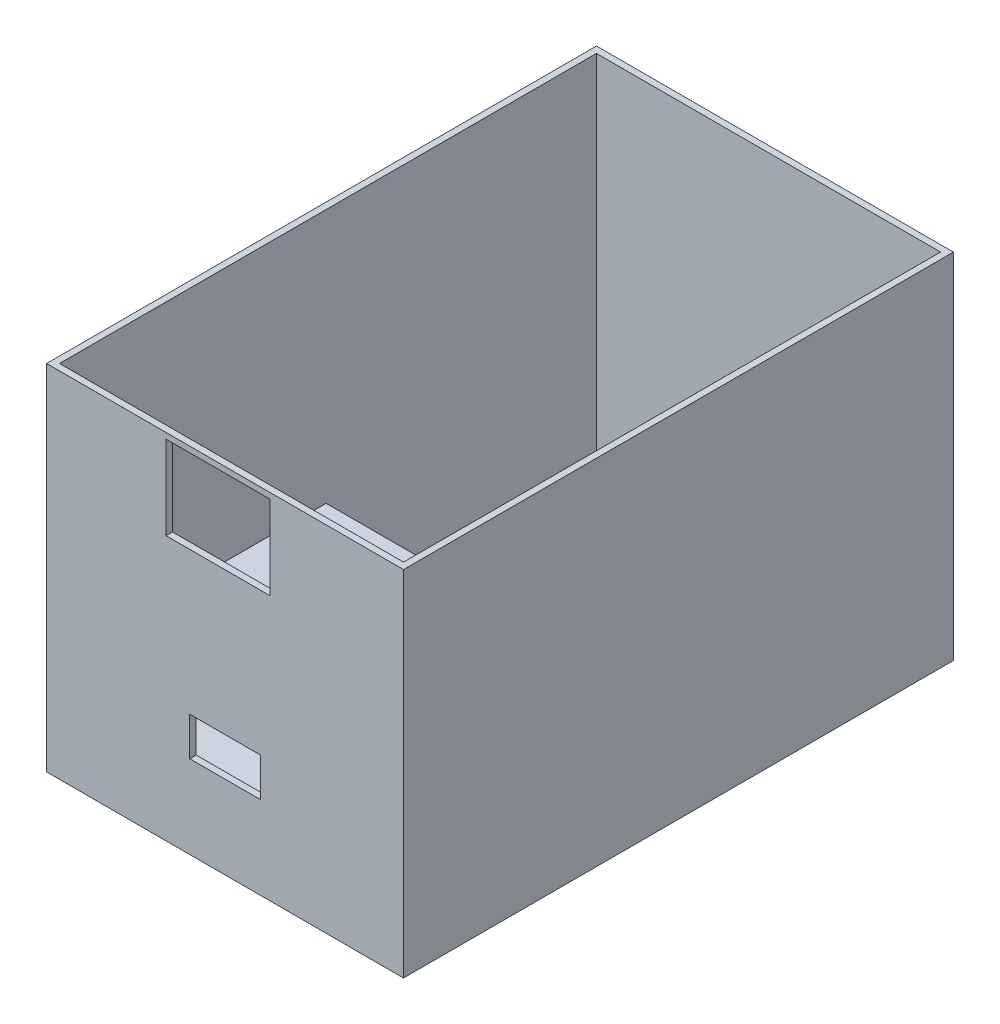
ISO-10303-21;
HEADER;
FILE_DESCRIPTION(('STEP AP214'),'2;1');
FILE_NAME('part.step','',(''),(''),'','','');
FILE_SCHEMA(('AUTOMOTIVE_DESIGN { 1 0 10303 214 1 1 1 1 }'));
ENDSEC;
DATA;
#1=APPLICATION_CONTEXT('core data for automotive mechanical design processes');
#2=APPLICATION_PROTOCOL_DEFINITION('international standard','automotive_design',2000,#1);
#3=PRODUCT_CONTEXT('',#1,'mechanical');
#4=PRODUCT('Part','Part','',(#3));
#5=PRODUCT_RELATED_PRODUCT_CATEGORY('part','',(#4));
#6=PRODUCT_DEFINITION_FORMATION('','',#4);
#7=PRODUCT_DEFINITION_CONTEXT('part definition',#1,'design');
#8=PRODUCT_DEFINITION('design','',#6,#7);
#9=PRODUCT_DEFINITION_SHAPE('','',#8);
#10=(LENGTH_UNIT() NAMED_UNIT(*) SI_UNIT(.MILLI.,.METRE.));
#11=(NAMED_UNIT(*) PLANE_ANGLE_UNIT() SI_UNIT($,.RADIAN.));
#12=(NAMED_UNIT(*) SI_UNIT($,.STERADIAN.) SOLID_ANGLE_UNIT());
#13=UNCERTAINTY_MEASURE_WITH_UNIT(LENGTH_MEASURE(1.E-05),#10,'distance_accuracy_value','');
#14=(GEOMETRIC_REPRESENTATION_CONTEXT(3) GLOBAL_UNCERTAINTY_ASSIGNED_CONTEXT((#13)) GLOBAL_UNIT_ASSIGNED_CONTEXT((#10,
#11,#12)) REPRESENTATION_CONTEXT('',''));
#15=CARTESIAN_POINT('',(0.,0.,0.));
#16=DIRECTION('',(0.,0.,1.));
#17=DIRECTION('',(1.,0.,0.));
#18=AXIS2_PLACEMENT_3D('',#15,#16,#17);
#19=CARTESIAN_POINT('',(-26.75,54.,41.75));
#20=DIRECTION('',(0.,0.,-1.));
#21=DIRECTION('',(-1.,0.,0.));
#22=AXIS2_PLACEMENT_3D('',#19,#20,#21);
#23=PLANE('',#22);
#24=DIRECTION('',(0.,1.,0.));
#25=VECTOR('',#24,1.);
#26=CARTESIAN_POINT('',(-9.18033939269946,53.1,41.75));
#27=LINE('',#26,#25);
#28=CARTESIAN_POINT('',(-9.18033939269946,40.1,41.75));
#29=VERTEX_POINT('',#28);
#30=CARTESIAN_POINT('',(-9.18033939269946,53.1,41.75));
#31=VERTEX_POINT('',#30);
#32=EDGE_CURVE('E81',#29,#31,#27,.T.);
#33=ORIENTED_EDGE('',*,*,#32,.F.);
#34=DIRECTION('',(-1.,0.,0.));
#35=VECTOR('',#34,1.);
#36=CARTESIAN_POINT('',(7.01966060730054,40.1,41.75));
#37=LINE('',#36,#35);
#38=CARTESIAN_POINT('',(7.01966060730054,40.1,41.75));
#39=VERTEX_POINT('',#38);
#40=EDGE_CURVE('E223',#39,#29,#37,.T.);
#41=ORIENTED_EDGE('',*,*,#40,.F.);
#42=DIRECTION('',(0.,-1.,0.));
#43=VECTOR('',#42,1.);
#44=CARTESIAN_POINT('',(7.01966060730054,53.1,41.75));
#45=LINE('',#44,#43);
#46=CARTESIAN_POINT('',(7.01966060730054,53.1,41.75));
#47=VERTEX_POINT('',#46);
#48=EDGE_CURVE('E227',#47,#39,#45,.T.);
#49=ORIENTED_EDGE('',*,*,#48,.F.);
#50=DIRECTION('',(1.,0.,0.));
#51=VECTOR('',#50,1.);
#52=CARTESIAN_POINT('',(7.01966060730054,53.1,41.75));
#53=LINE('',#52,#51);
#54=EDGE_CURVE('E236',#31,#47,#53,.T.);
#55=ORIENTED_EDGE('',*,*,#54,.F.);
#56=EDGE_LOOP('',(#33,#41,#49,#55));
#57=FACE_BOUND('',#56,.T.);
#58=DIRECTION('',(0.,1.,0.));
#59=VECTOR('',#58,1.);
#60=CARTESIAN_POINT('',(5.5,17.9,41.75));
#61=LINE('',#60,#59);
#62=CARTESIAN_POINT('',(5.5,11.9,41.75));
#63=VERTEX_POINT('',#62);
#64=CARTESIAN_POINT('',(5.5,17.9,41.75));
#65=VERTEX_POINT('',#64);
#66=EDGE_CURVE('E292',#63,#65,#61,.T.);
#67=ORIENTED_EDGE('',*,*,#66,.T.);
#68=DIRECTION('',(-1.,0.,0.));
#69=VECTOR('',#68,1.);
#70=CARTESIAN_POINT('',(-5.5,17.9,41.75));
#71=LINE('',#70,#69);
#72=CARTESIAN_POINT('',(-5.5,17.9,41.75));
#73=VERTEX_POINT('',#72);
#74=EDGE_CURVE('E296',#65,#73,#71,.T.);
#75=ORIENTED_EDGE('',*,*,#74,.T.);
#76=DIRECTION('',(0.,-1.,0.));
#77=VECTOR('',#76,1.);
#78=CARTESIAN_POINT('',(-5.5,17.9,41.75));
#79=LINE('',#78,#77);
#80=CARTESIAN_POINT('',(-5.5,11.9,41.75));
#81=VERTEX_POINT('',#80);
#82=EDGE_CURVE('E301',#73,#81,#79,.T.);
#83=ORIENTED_EDGE('',*,*,#82,.T.);
#84=DIRECTION('',(1.,0.,0.));
#85=VECTOR('',#84,1.);
#86=CARTESIAN_POINT('',(-5.5,11.9,41.75));
#87=LINE('',#86,#85);
#88=EDGE_CURVE('E305',#81,#63,#87,.T.);
#89=ORIENTED_EDGE('',*,*,#88,.T.);
#90=EDGE_LOOP('',(#67,#75,#83,#89));
#91=FACE_BOUND('',#90,.T.);
#92=DIRECTION('',(1.,0.,0.));
#93=VECTOR('',#92,1.);
#94=CARTESIAN_POINT('',(-26.75,0.,41.75));
#95=LINE('',#94,#93);
#96=CARTESIAN_POINT('',(-26.75,0.,41.75));
#97=VERTEX_POINT('',#96);
#98=CARTESIAN_POINT('',(26.75,0.,41.75));
#99=VERTEX_POINT('',#98);
#100=EDGE_CURVE('E351',#97,#99,#95,.T.);
#101=ORIENTED_EDGE('',*,*,#100,.F.);
#102=DIRECTION('',(0.,-1.,0.));
#103=VECTOR('',#102,1.);
#104=CARTESIAN_POINT('',(-26.75,54.,41.75));
#105=LINE('',#104,#103);
#106=CARTESIAN_POINT('',(-26.75,54.,41.75));
#107=VERTEX_POINT('',#106);
#108=EDGE_CURVE('E367',#107,#97,#105,.T.);
#109=ORIENTED_EDGE('',*,*,#108,.F.);
#110=DIRECTION('',(1.,0.,0.));
#111=VECTOR('',#110,1.);
#112=CARTESIAN_POINT('',(-26.75,54.,41.75));
#113=LINE('',#112,#111);
#114=CARTESIAN_POINT('',(26.75,54.,41.75));
#115=VERTEX_POINT('',#114);
#116=EDGE_CURVE('E352',#107,#115,#113,.T.);
#117=ORIENTED_EDGE('',*,*,#116,.T.);
#118=DIRECTION('',(0.,-1.,0.));
#119=VECTOR('',#118,1.);
#120=CARTESIAN_POINT('',(26.75,54.,41.75));
#121=LINE('',#120,#119);
#122=EDGE_CURVE('E391',#115,#99,#121,.T.);
#123=ORIENTED_EDGE('',*,*,#122,.T.);
#124=EDGE_LOOP('',(#101,#109,#117,#123));
#125=FACE_BOUND('',#124,.T.);
#126=DIRECTION('',(1.,0.,0.));
#127=VECTOR('',#126,1.);
#128=CARTESIAN_POINT('',(14.7138774485398,25.9,41.75));
#129=LINE('',#128,#127);
#130=CARTESIAN_POINT('',(-15.2861225514602,25.9,41.75));
#131=VERTEX_POINT('',#130);
#132=CARTESIAN_POINT('',(14.7138774485398,25.9,41.75));
#133=VERTEX_POINT('',#132);
#134=EDGE_CURVE('E269',#131,#133,#129,.T.);
#135=ORIENTED_EDGE('',*,*,#134,.F.);
#136=DIRECTION('',(0.,1.,0.));
#137=VECTOR('',#136,1.);
#138=CARTESIAN_POINT('',(-15.2861225514602,25.9,41.75));
#139=LINE('',#138,#137);
#140=CARTESIAN_POINT('',(-15.2861225514602,20.9,41.75));
#141=VERTEX_POINT('',#140);
#142=EDGE_CURVE('E245',#141,#131,#139,.T.);
#143=ORIENTED_EDGE('',*,*,#142,.F.);
#144=DIRECTION('',(-1.,0.,0.));
#145=VECTOR('',#144,1.);
#146=CARTESIAN_POINT('',(14.7138774485398,20.9,41.75));
#147=LINE('',#146,#145);
#148=CARTESIAN_POINT('',(14.7138774485398,20.9,41.75));
#149=VERTEX_POINT('',#148);
#150=EDGE_CURVE('E256',#149,#141,#147,.T.);
#151=ORIENTED_EDGE('',*,*,#150,.F.);
#152=DIRECTION('',(0.,-1.,0.));
#153=VECTOR('',#152,1.);
#154=CARTESIAN_POINT('',(14.7138774485398,25.9,41.75));
#155=LINE('',#154,#153);
#156=EDGE_CURVE('E272',#133,#149,#155,.T.);
#157=ORIENTED_EDGE('',*,*,#156,.F.);
#158=EDGE_LOOP('',(#135,#143,#151,#157));
#159=FACE_BOUND('',#158,.T.);
#160=ADVANCED_FACE('F63',(#57,#91,#125,#159),#23,.T.);
#161=CARTESIAN_POINT('',(0.,54.,0.));
#162=DIRECTION('',(0.,-1.,0.));
#163=DIRECTION('',(0.,0.,-1.));
#164=AXIS2_PLACEMENT_3D('',#161,#162,#163);
#165=PLANE('',#164);
#166=DIRECTION('',(1.,0.,0.));
#167=VECTOR('',#166,1.);
#168=CARTESIAN_POINT('',(-27.75,54.,-42.75));
#169=LINE('',#168,#167);
#170=CARTESIAN_POINT('',(-27.75,54.,-42.75));
#171=VERTEX_POINT('',#170);
#172=CARTESIAN_POINT('',(27.75,54.,-42.75));
#173=VERTEX_POINT('',#172);
#174=EDGE_CURVE('E395',#171,#173,#169,.T.);
#175=ORIENTED_EDGE('',*,*,#174,.F.);
#176=DIRECTION('',(0.,0.,1.));
#177=VECTOR('',#176,1.);
#178=CARTESIAN_POINT('',(-27.75,54.,-42.75));
#179=LINE('',#178,#177);
#180=CARTESIAN_POINT('',(-27.75,54.,42.75));
#181=VERTEX_POINT('',#180);
#182=EDGE_CURVE('E406',#171,#181,#179,.T.);
#183=ORIENTED_EDGE('',*,*,#182,.T.);
#184=DIRECTION('',(1.,0.,0.));
#185=VECTOR('',#184,1.);
#186=CARTESIAN_POINT('',(-27.75,54.,42.75));
#187=LINE('',#186,#185);
#188=CARTESIAN_POINT('',(27.75,54.,42.75));
#189=VERTEX_POINT('',#188);
#190=EDGE_CURVE('E403',#181,#189,#187,.T.);
#191=ORIENTED_EDGE('',*,*,#190,.T.);
#192=DIRECTION('',(0.,0.,1.));
#193=VECTOR('',#192,1.);
#194=CARTESIAN_POINT('',(27.75,54.,-42.75));
#195=LINE('',#194,#193);
#196=EDGE_CURVE('E399',#173,#189,#195,.T.);
#197=ORIENTED_EDGE('',*,*,#196,.F.);
#198=EDGE_LOOP('',(#175,#183,#191,#197));
#199=FACE_BOUND('',#198,.T.);
#200=ORIENTED_EDGE('',*,*,#116,.F.);
#201=DIRECTION('',(0.,0.,-1.));
#202=VECTOR('',#201,1.);
#203=CARTESIAN_POINT('',(-26.75,54.,41.75));
#204=LINE('',#203,#202);
#205=CARTESIAN_POINT('',(-26.75,54.,-41.75));
#206=VERTEX_POINT('',#205);
#207=EDGE_CURVE('E363',#107,#206,#204,.T.);
#208=ORIENTED_EDGE('',*,*,#207,.T.);
#209=DIRECTION('',(1.,0.,0.));
#210=VECTOR('',#209,1.);
#211=CARTESIAN_POINT('',(-26.75,54.,-41.75));
#212=LINE('',#211,#210);
#213=CARTESIAN_POINT('',(26.75,54.,-41.75));
#214=VERTEX_POINT('',#213);
#215=EDGE_CURVE('E359',#206,#214,#212,.T.);
#216=ORIENTED_EDGE('',*,*,#215,.T.);
#217=DIRECTION('',(0.,0.,-1.));
#218=VECTOR('',#217,1.);
#219=CARTESIAN_POINT('',(26.75,54.,41.75));
#220=LINE('',#219,#218);
#221=EDGE_CURVE('E355',#115,#214,#220,.T.);
#222=ORIENTED_EDGE('',*,*,#221,.F.);
#223=EDGE_LOOP('',(#200,#208,#216,#222));
#224=FACE_BOUND('',#223,.T.);
#225=ADVANCED_FACE('F437',(#199,#224),#165,.F.);
#226=CARTESIAN_POINT('',(-27.75,54.,-42.75));
#227=DIRECTION('',(0.,0.,-1.));
#228=DIRECTION('',(-1.,0.,0.));
#229=AXIS2_PLACEMENT_3D('',#226,#227,#228);
#230=PLANE('',#229);
#231=DIRECTION('',(0.,-1.,0.));
#232=VECTOR('',#231,1.);
#233=CARTESIAN_POINT('',(27.75,54.,-42.75));
#234=LINE('',#233,#232);
#235=CARTESIAN_POINT('',(27.75,-1.,-42.75));
#236=VERTEX_POINT('',#235);
#237=EDGE_CURVE('E67',#173,#236,#234,.T.);
#238=ORIENTED_EDGE('',*,*,#237,.T.);
#239=DIRECTION('',(1.,0.,0.));
#240=VECTOR('',#239,1.);
#241=CARTESIAN_POINT('',(-27.75,-1.,-42.75));
#242=LINE('',#241,#240);
#243=CARTESIAN_POINT('',(-27.75,-1.,-42.75));
#244=VERTEX_POINT('',#243);
#245=EDGE_CURVE('E339',#244,#236,#242,.T.);
#246=ORIENTED_EDGE('',*,*,#245,.F.);
#247=DIRECTION('',(0.,-1.,0.));
#248=VECTOR('',#247,1.);
#249=CARTESIAN_POINT('',(-27.75,54.,-42.75));
#250=LINE('',#249,#248);
#251=EDGE_CURVE('E12',#171,#244,#250,.T.);
#252=ORIENTED_EDGE('',*,*,#251,.F.);
#253=ORIENTED_EDGE('',*,*,#174,.T.);
#254=EDGE_LOOP('',(#238,#246,#252,#253));
#255=FACE_BOUND('',#254,.T.);
#256=ADVANCED_FACE('F65',(#255),#230,.T.);
#257=CARTESIAN_POINT('',(-27.75,54.,-42.75));
#258=DIRECTION('',(1.,0.,0.));
#259=DIRECTION('',(0.,0.,-1.));
#260=AXIS2_PLACEMENT_3D('',#257,#258,#259);
#261=PLANE('',#260);
#262=ORIENTED_EDGE('',*,*,#251,.T.);
#263=DIRECTION('',(0.,0.,-1.));
#264=VECTOR('',#263,1.);
#265=CARTESIAN_POINT('',(-27.75,-1.,42.75));
#266=LINE('',#265,#264);
#267=CARTESIAN_POINT('',(-27.75,-1.,42.75));
#268=VERTEX_POINT('',#267);
#269=EDGE_CURVE('E326',#268,#244,#266,.T.);
#270=ORIENTED_EDGE('',*,*,#269,.F.);
#271=DIRECTION('',(0.,-1.,0.));
#272=VECTOR('',#271,1.);
#273=CARTESIAN_POINT('',(-27.75,54.,42.75));
#274=LINE('',#273,#272);
#275=EDGE_CURVE('E73',#181,#268,#274,.T.);
#276=ORIENTED_EDGE('',*,*,#275,.F.);
#277=ORIENTED_EDGE('',*,*,#182,.F.);
#278=EDGE_LOOP('',(#262,#270,#276,#277));
#279=FACE_BOUND('',#278,.T.);
#280=ADVANCED_FACE('F434',(#279),#261,.F.);
#281=CARTESIAN_POINT('',(-27.75,54.,42.75));
#282=DIRECTION('',(0.,0.,-1.));
#283=DIRECTION('',(-1.,0.,0.));
#284=AXIS2_PLACEMENT_3D('',#281,#282,#283);
#285=PLANE('',#284);
#286=DIRECTION('',(-1.,0.,0.));
#287=VECTOR('',#286,1.);
#288=CARTESIAN_POINT('',(7.01966060730054,40.1,42.75));
#289=LINE('',#288,#287);
#290=CARTESIAN_POINT('',(7.01966060730054,40.1,42.75));
#291=VERTEX_POINT('',#290);
#292=CARTESIAN_POINT('',(-9.18033939269946,40.1,42.75));
#293=VERTEX_POINT('',#292);
#294=EDGE_CURVE('E211',#291,#293,#289,.T.);
#295=ORIENTED_EDGE('',*,*,#294,.T.);
#296=DIRECTION('',(0.,1.,0.));
#297=VECTOR('',#296,1.);
#298=CARTESIAN_POINT('',(-9.18033939269946,53.1,42.75));
#299=LINE('',#298,#297);
#300=CARTESIAN_POINT('',(-9.18033939269946,53.1,42.75));
#301=VERTEX_POINT('',#300);
#302=EDGE_CURVE('E204',#293,#301,#299,.T.);
#303=ORIENTED_EDGE('',*,*,#302,.T.);
#304=DIRECTION('',(1.,0.,0.));
#305=VECTOR('',#304,1.);
#306=CARTESIAN_POINT('',(7.01966060730054,53.1,42.75));
#307=LINE('',#306,#305);
#308=CARTESIAN_POINT('',(7.01966060730054,53.1,42.75));
#309=VERTEX_POINT('',#308);
#310=EDGE_CURVE('E214',#301,#309,#307,.T.);
#311=ORIENTED_EDGE('',*,*,#310,.T.);
#312=DIRECTION('',(0.,-1.,0.));
#313=VECTOR('',#312,1.);
#314=CARTESIAN_POINT('',(7.01966060730054,53.1,42.75));
#315=LINE('',#314,#313);
#316=EDGE_CURVE('E89',#309,#291,#315,.T.);
#317=ORIENTED_EDGE('',*,*,#316,.T.);
#318=EDGE_LOOP('',(#295,#303,#311,#317));
#319=FACE_BOUND('',#318,.T.);
#320=DIRECTION('',(-1.,0.,0.));
#321=VECTOR('',#320,1.);
#322=CARTESIAN_POINT('',(-5.5,17.9,42.75));
#323=LINE('',#322,#321);
#324=CARTESIAN_POINT('',(5.49999999999999,17.9,42.75));
#325=VERTEX_POINT('',#324);
#326=CARTESIAN_POINT('',(-5.5,17.9,42.75));
#327=VERTEX_POINT('',#326);
#328=EDGE_CURVE('E312',#325,#327,#323,.T.);
#329=ORIENTED_EDGE('',*,*,#328,.F.);
#330=DIRECTION('',(0.,1.,0.));
#331=VECTOR('',#330,1.);
#332=CARTESIAN_POINT('',(5.5,17.9,42.75));
#333=LINE('',#332,#331);
#334=CARTESIAN_POINT('',(5.5,11.9,42.75));
#335=VERTEX_POINT('',#334);
#336=EDGE_CURVE('E291',#335,#325,#333,.T.);
#337=ORIENTED_EDGE('',*,*,#336,.F.);
#338=DIRECTION('',(1.,0.,0.));
#339=VECTOR('',#338,1.);
#340=CARTESIAN_POINT('',(-5.5,11.9,42.75));
#341=LINE('',#340,#339);
#342=CARTESIAN_POINT('',(-5.5,11.9,42.75));
#343=VERTEX_POINT('',#342);
#344=EDGE_CURVE('E297',#343,#335,#341,.T.);
#345=ORIENTED_EDGE('',*,*,#344,.F.);
#346=DIRECTION('',(0.,-1.,0.));
#347=VECTOR('',#346,1.);
#348=CARTESIAN_POINT('',(-5.5,17.9,42.75));
#349=LINE('',#348,#347);
#350=EDGE_CURVE('E316',#327,#343,#349,.T.);
#351=ORIENTED_EDGE('',*,*,#350,.F.);
#352=EDGE_LOOP('',(#329,#337,#345,#351));
#353=FACE_BOUND('',#352,.T.);
#354=ORIENTED_EDGE('',*,*,#275,.T.);
#355=DIRECTION('',(-1.,0.,0.));
#356=VECTOR('',#355,1.);
#357=CARTESIAN_POINT('',(-27.75,-1.,42.75));
#358=LINE('',#357,#356);
#359=CARTESIAN_POINT('',(27.75,-1.,42.75));
#360=VERTEX_POINT('',#359);
#361=EDGE_CURVE('E347',#360,#268,#358,.T.);
#362=ORIENTED_EDGE('',*,*,#361,.F.);
#363=DIRECTION('',(0.,-1.,0.));
#364=VECTOR('',#363,1.);
#365=CARTESIAN_POINT('',(27.75,54.,42.75));
#366=LINE('',#365,#364);
#367=EDGE_CURVE('E410',#189,#360,#366,.T.);
#368=ORIENTED_EDGE('',*,*,#367,.F.);
#369=ORIENTED_EDGE('',*,*,#190,.F.);
#370=EDGE_LOOP('',(#354,#362,#368,#369));
#371=FACE_BOUND('',#370,.T.);
#372=ADVANCED_FACE('F219',(#319,#353,#371),#285,.F.);
#373=CARTESIAN_POINT('',(27.75,54.,-42.75));
#374=DIRECTION('',(1.,0.,0.));
#375=DIRECTION('',(0.,0.,-1.));
#376=AXIS2_PLACEMENT_3D('',#373,#374,#375);
#377=PLANE('',#376);
#378=ORIENTED_EDGE('',*,*,#367,.T.);
#379=DIRECTION('',(0.,0.,1.));
#380=VECTOR('',#379,1.);
#381=CARTESIAN_POINT('',(27.75,-1.,42.75));
#382=LINE('',#381,#380);
#383=EDGE_CURVE('E343',#236,#360,#382,.T.);
#384=ORIENTED_EDGE('',*,*,#383,.F.);
#385=ORIENTED_EDGE('',*,*,#237,.F.);
#386=ORIENTED_EDGE('',*,*,#196,.T.);
#387=EDGE_LOOP('',(#378,#384,#385,#386));
#388=FACE_BOUND('',#387,.T.);
#389=ADVANCED_FACE('F424',(#388),#377,.T.);
#390=CARTESIAN_POINT('',(26.75,54.,41.75));
#391=DIRECTION('',(-1.,0.,0.));
#392=DIRECTION('',(0.,0.,1.));
#393=AXIS2_PLACEMENT_3D('',#390,#391,#392);
#394=PLANE('',#393);
#395=DIRECTION('',(0.,0.,-1.));
#396=VECTOR('',#395,1.);
#397=CARTESIAN_POINT('',(26.75,0.,41.75));
#398=LINE('',#397,#396);
#399=CARTESIAN_POINT('',(26.75,0.,-41.75));
#400=VERTEX_POINT('',#399);
#401=EDGE_CURVE('E370',#99,#400,#398,.T.);
#402=ORIENTED_EDGE('',*,*,#401,.F.);
#403=ORIENTED_EDGE('',*,*,#122,.F.);
#404=ORIENTED_EDGE('',*,*,#221,.T.);
#405=DIRECTION('',(0.,-1.,0.));
#406=VECTOR('',#405,1.);
#407=CARTESIAN_POINT('',(26.75,54.,-41.75));
#408=LINE('',#407,#406);
#409=EDGE_CURVE('E387',#214,#400,#408,.T.);
#410=ORIENTED_EDGE('',*,*,#409,.T.);
#411=EDGE_LOOP('',(#402,#403,#404,#410));
#412=FACE_BOUND('',#411,.T.);
#413=ADVANCED_FACE('F426',(#412),#394,.T.);
#414=CARTESIAN_POINT('',(-26.75,54.,-41.75));
#415=DIRECTION('',(0.,0.,-1.));
#416=DIRECTION('',(-1.,0.,0.));
#417=AXIS2_PLACEMENT_3D('',#414,#415,#416);
#418=PLANE('',#417);
#419=DIRECTION('',(1.,0.,0.));
#420=VECTOR('',#419,1.);
#421=CARTESIAN_POINT('',(-26.75,0.,-41.75));
#422=LINE('',#421,#420);
#423=CARTESIAN_POINT('',(-26.75,0.,-41.75));
#424=VERTEX_POINT('',#423);
#425=EDGE_CURVE('E373',#424,#400,#422,.T.);
#426=ORIENTED_EDGE('',*,*,#425,.T.);
#427=ORIENTED_EDGE('',*,*,#409,.F.);
#428=ORIENTED_EDGE('',*,*,#215,.F.);
#429=DIRECTION('',(0.,-1.,0.));
#430=VECTOR('',#429,1.);
#431=CARTESIAN_POINT('',(-26.75,54.,-41.75));
#432=LINE('',#431,#430);
#433=EDGE_CURVE('E383',#206,#424,#432,.T.);
#434=ORIENTED_EDGE('',*,*,#433,.T.);
#435=EDGE_LOOP('',(#426,#427,#428,#434));
#436=FACE_BOUND('',#435,.T.);
#437=ADVANCED_FACE('F431',(#436),#418,.F.);
#438=CARTESIAN_POINT('',(-26.75,54.,41.75));
#439=DIRECTION('',(-1.,0.,0.));
#440=DIRECTION('',(0.,0.,1.));
#441=AXIS2_PLACEMENT_3D('',#438,#439,#440);
#442=PLANE('',#441);
#443=DIRECTION('',(0.,0.,-1.));
#444=VECTOR('',#443,1.);
#445=CARTESIAN_POINT('',(-26.75,0.,41.75));
#446=LINE('',#445,#444);
#447=EDGE_CURVE('E356',#97,#424,#446,.T.);
#448=ORIENTED_EDGE('',*,*,#447,.T.);
#449=ORIENTED_EDGE('',*,*,#433,.F.);
#450=ORIENTED_EDGE('',*,*,#207,.F.);
#451=ORIENTED_EDGE('',*,*,#108,.T.);
#452=EDGE_LOOP('',(#448,#449,#450,#451));
#453=FACE_BOUND('',#452,.T.);
#454=ADVANCED_FACE('F470',(#453),#442,.F.);
#455=CARTESIAN_POINT('',(0.,0.,0.));
#456=DIRECTION('',(0.,-1.,0.));
#457=DIRECTION('',(0.,0.,-1.));
#458=AXIS2_PLACEMENT_3D('',#455,#456,#457);
#459=PLANE('',#458);
#460=ORIENTED_EDGE('',*,*,#447,.F.);
#461=ORIENTED_EDGE('',*,*,#100,.T.);
#462=ORIENTED_EDGE('',*,*,#401,.T.);
#463=ORIENTED_EDGE('',*,*,#425,.F.);
#464=EDGE_LOOP('',(#460,#461,#462,#463));
#465=FACE_BOUND('',#464,.T.);
#466=ADVANCED_FACE('F468',(#465),#459,.F.);
#467=CARTESIAN_POINT('',(0.,-1.,0.));
#468=DIRECTION('',(0.,-1.,0.));
#469=DIRECTION('',(0.,0.,-1.));
#470=AXIS2_PLACEMENT_3D('',#467,#468,#469);
#471=PLANE('',#470);
#472=ORIENTED_EDGE('',*,*,#269,.T.);
#473=ORIENTED_EDGE('',*,*,#245,.T.);
#474=ORIENTED_EDGE('',*,*,#383,.T.);
#475=ORIENTED_EDGE('',*,*,#361,.T.);
#476=EDGE_LOOP('',(#472,#473,#474,#475));
#477=FACE_BOUND('',#476,.T.);
#478=ADVANCED_FACE('F421',(#477),#471,.T.);
#479=CARTESIAN_POINT('',(5.5,17.9,41.75));
#480=DIRECTION('',(1.,0.,0.));
#481=DIRECTION('',(0.,1.,0.));
#482=AXIS2_PLACEMENT_3D('',#479,#480,#481);
#483=PLANE('',#482);
#484=ORIENTED_EDGE('',*,*,#336,.T.);
#485=DIRECTION('',(0.,0.,1.));
#486=VECTOR('',#485,1.);
#487=CARTESIAN_POINT('',(5.5,17.9,41.75));
#488=LINE('',#487,#486);
#489=EDGE_CURVE('E309',#65,#325,#488,.T.);
#490=ORIENTED_EDGE('',*,*,#489,.F.);
#491=ORIENTED_EDGE('',*,*,#66,.F.);
#492=DIRECTION('',(0.,0.,1.));
#493=VECTOR('',#492,1.);
#494=CARTESIAN_POINT('',(5.5,11.9,41.75));
#495=LINE('',#494,#493);
#496=EDGE_CURVE('E323',#63,#335,#495,.T.);
#497=ORIENTED_EDGE('',*,*,#496,.T.);
#498=EDGE_LOOP('',(#484,#490,#491,#497));
#499=FACE_BOUND('',#498,.T.);
#500=ADVANCED_FACE('F483',(#499),#483,.F.);
#501=CARTESIAN_POINT('',(-5.5,11.9,41.75));
#502=DIRECTION('',(0.,-1.,0.));
#503=DIRECTION('',(1.,0.,0.));
#504=AXIS2_PLACEMENT_3D('',#501,#502,#503);
#505=PLANE('',#504);
#506=ORIENTED_EDGE('',*,*,#344,.T.);
#507=ORIENTED_EDGE('',*,*,#496,.F.);
#508=ORIENTED_EDGE('',*,*,#88,.F.);
#509=DIRECTION('',(0.,0.,1.));
#510=VECTOR('',#509,1.);
#511=CARTESIAN_POINT('',(-5.5,11.9,41.75));
#512=LINE('',#511,#510);
#513=EDGE_CURVE('E327',#81,#343,#512,.T.);
#514=ORIENTED_EDGE('',*,*,#513,.T.);
#515=EDGE_LOOP('',(#506,#507,#508,#514));
#516=FACE_BOUND('',#515,.T.);
#517=ADVANCED_FACE('F486',(#516),#505,.F.);
#518=CARTESIAN_POINT('',(-5.5,17.9,41.75));
#519=DIRECTION('',(-1.,0.,0.));
#520=DIRECTION('',(0.,-1.,0.));
#521=AXIS2_PLACEMENT_3D('',#518,#519,#520);
#522=PLANE('',#521);
#523=ORIENTED_EDGE('',*,*,#350,.T.);
#524=ORIENTED_EDGE('',*,*,#513,.F.);
#525=ORIENTED_EDGE('',*,*,#82,.F.);
#526=DIRECTION('',(0.,0.,1.));
#527=VECTOR('',#526,1.);
#528=CARTESIAN_POINT('',(-5.5,17.9,41.75));
#529=LINE('',#528,#527);
#530=EDGE_CURVE('E330',#73,#327,#529,.T.);
#531=ORIENTED_EDGE('',*,*,#530,.T.);
#532=EDGE_LOOP('',(#523,#524,#525,#531));
#533=FACE_BOUND('',#532,.T.);
#534=ADVANCED_FACE('F492',(#533),#522,.F.);
#535=CARTESIAN_POINT('',(-5.5,17.9,41.75));
#536=DIRECTION('',(0.,1.,0.));
#537=DIRECTION('',(-1.,0.,0.));
#538=AXIS2_PLACEMENT_3D('',#535,#536,#537);
#539=PLANE('',#538);
#540=ORIENTED_EDGE('',*,*,#328,.T.);
#541=ORIENTED_EDGE('',*,*,#530,.F.);
#542=ORIENTED_EDGE('',*,*,#74,.F.);
#543=ORIENTED_EDGE('',*,*,#489,.T.);
#544=EDGE_LOOP('',(#540,#541,#542,#543));
#545=FACE_BOUND('',#544,.T.);
#546=ADVANCED_FACE('F488',(#545),#539,.F.);
#547=CARTESIAN_POINT('',(-15.2861225514602,25.9,11.75));
#548=DIRECTION('',(1.,0.,0.));
#549=DIRECTION('',(0.,0.,-1.));
#550=AXIS2_PLACEMENT_3D('',#547,#548,#549);
#551=PLANE('',#550);
#552=ORIENTED_EDGE('',*,*,#142,.T.);
#553=DIRECTION('',(0.,0.,1.));
#554=VECTOR('',#553,1.);
#555=CARTESIAN_POINT('',(-15.2861225514602,25.9,11.75));
#556=LINE('',#555,#554);
#557=CARTESIAN_POINT('',(-15.2861225514602,25.9,11.75));
#558=VERTEX_POINT('',#557);
#559=EDGE_CURVE('E288',#558,#131,#556,.T.);
#560=ORIENTED_EDGE('',*,*,#559,.F.);
#561=DIRECTION('',(0.,1.,0.));
#562=VECTOR('',#561,1.);
#563=CARTESIAN_POINT('',(-15.2861225514602,25.9,11.75));
#564=LINE('',#563,#562);
#565=CARTESIAN_POINT('',(-15.2861225514602,20.9,11.75));
#566=VERTEX_POINT('',#565);
#567=EDGE_CURVE('E251',#566,#558,#564,.T.);
#568=ORIENTED_EDGE('',*,*,#567,.F.);
#569=DIRECTION('',(0.,0.,1.));
#570=VECTOR('',#569,1.);
#571=CARTESIAN_POINT('',(-15.2861225514602,20.9,11.75));
#572=LINE('',#571,#570);
#573=EDGE_CURVE('E265',#566,#141,#572,.T.);
#574=ORIENTED_EDGE('',*,*,#573,.T.);
#575=EDGE_LOOP('',(#552,#560,#568,#574));
#576=FACE_BOUND('',#575,.T.);
#577=ADVANCED_FACE('F491',(#576),#551,.F.);
#578=CARTESIAN_POINT('',(14.7138774485398,25.9,11.75));
#579=DIRECTION('',(0.,-1.,0.));
#580=DIRECTION('',(1.,0.,0.));
#581=AXIS2_PLACEMENT_3D('',#578,#579,#580);
#582=PLANE('',#581);
#583=ORIENTED_EDGE('',*,*,#134,.T.);
#584=DIRECTION('',(0.,0.,1.));
#585=VECTOR('',#584,1.);
#586=CARTESIAN_POINT('',(14.7138774485398,25.9,11.75));
#587=LINE('',#586,#585);
#588=CARTESIAN_POINT('',(14.7138774485398,25.9,11.75));
#589=VERTEX_POINT('',#588);
#590=EDGE_CURVE('E284',#589,#133,#587,.T.);
#591=ORIENTED_EDGE('',*,*,#590,.F.);
#592=DIRECTION('',(1.,0.,0.));
#593=VECTOR('',#592,1.);
#594=CARTESIAN_POINT('',(14.7138774485398,25.9,11.75));
#595=LINE('',#594,#593);
#596=EDGE_CURVE('E255',#558,#589,#595,.T.);
#597=ORIENTED_EDGE('',*,*,#596,.F.);
#598=ORIENTED_EDGE('',*,*,#559,.T.);
#599=EDGE_LOOP('',(#583,#591,#597,#598));
#600=FACE_BOUND('',#599,.T.);
#601=ADVANCED_FACE('F502',(#600),#582,.F.);
#602=CARTESIAN_POINT('',(14.7138774485398,25.9,11.75));
#603=DIRECTION('',(-1.,0.,0.));
#604=DIRECTION('',(0.,0.,1.));
#605=AXIS2_PLACEMENT_3D('',#602,#603,#604);
#606=PLANE('',#605);
#607=ORIENTED_EDGE('',*,*,#156,.T.);
#608=DIRECTION('',(0.,0.,1.));
#609=VECTOR('',#608,1.);
#610=CARTESIAN_POINT('',(14.7138774485398,20.9,11.75));
#611=LINE('',#610,#609);
#612=CARTESIAN_POINT('',(14.7138774485398,20.9,11.75));
#613=VERTEX_POINT('',#612);
#614=EDGE_CURVE('E281',#613,#149,#611,.T.);
#615=ORIENTED_EDGE('',*,*,#614,.F.);
#616=DIRECTION('',(0.,-1.,0.));
#617=VECTOR('',#616,1.);
#618=CARTESIAN_POINT('',(14.7138774485398,25.9,11.75));
#619=LINE('',#618,#617);
#620=EDGE_CURVE('E259',#589,#613,#619,.T.);
#621=ORIENTED_EDGE('',*,*,#620,.F.);
#622=ORIENTED_EDGE('',*,*,#590,.T.);
#623=EDGE_LOOP('',(#607,#615,#621,#622));
#624=FACE_BOUND('',#623,.T.);
#625=ADVANCED_FACE('F506',(#624),#606,.F.);
#626=CARTESIAN_POINT('',(14.7138774485398,20.9,11.75));
#627=DIRECTION('',(0.,1.,0.));
#628=DIRECTION('',(-1.,0.,0.));
#629=AXIS2_PLACEMENT_3D('',#626,#627,#628);
#630=PLANE('',#629);
#631=ORIENTED_EDGE('',*,*,#150,.T.);
#632=ORIENTED_EDGE('',*,*,#573,.F.);
#633=DIRECTION('',(-1.,0.,0.));
#634=VECTOR('',#633,1.);
#635=CARTESIAN_POINT('',(14.7138774485398,20.9,11.75));
#636=LINE('',#635,#634);
#637=EDGE_CURVE('E262',#613,#566,#636,.T.);
#638=ORIENTED_EDGE('',*,*,#637,.F.);
#639=ORIENTED_EDGE('',*,*,#614,.T.);
#640=EDGE_LOOP('',(#631,#632,#638,#639));
#641=FACE_BOUND('',#640,.T.);
#642=ADVANCED_FACE('F510',(#641),#630,.F.);
#643=CARTESIAN_POINT('',(0.,0.,11.75));
#644=DIRECTION('',(0.,0.,-1.));
#645=DIRECTION('',(-1.,0.,0.));
#646=AXIS2_PLACEMENT_3D('',#643,#644,#645);
#647=PLANE('',#646);
#648=ORIENTED_EDGE('',*,*,#567,.T.);
#649=ORIENTED_EDGE('',*,*,#596,.T.);
#650=ORIENTED_EDGE('',*,*,#620,.T.);
#651=ORIENTED_EDGE('',*,*,#637,.T.);
#652=EDGE_LOOP('',(#648,#649,#650,#651));
#653=FACE_BOUND('',#652,.T.);
#654=ADVANCED_FACE('F514',(#653),#647,.T.);
#655=CARTESIAN_POINT('',(-9.18033939269946,53.1,42.75));
#656=DIRECTION('',(-1.,0.,0.));
#657=DIRECTION('',(0.,-1.,0.));
#658=AXIS2_PLACEMENT_3D('',#655,#656,#657);
#659=PLANE('',#658);
#660=ORIENTED_EDGE('',*,*,#32,.T.);
#661=DIRECTION('',(0.,0.,-1.));
#662=VECTOR('',#661,1.);
#663=CARTESIAN_POINT('',(-9.18033939269946,53.1,42.75));
#664=LINE('',#663,#662);
#665=EDGE_CURVE('E200',#301,#31,#664,.T.);
#666=ORIENTED_EDGE('',*,*,#665,.F.);
#667=ORIENTED_EDGE('',*,*,#302,.F.);
#668=DIRECTION('',(0.,0.,-1.));
#669=VECTOR('',#668,1.);
#670=CARTESIAN_POINT('',(-9.18033939269946,40.1,42.75));
#671=LINE('',#670,#669);
#672=EDGE_CURVE('E242',#293,#29,#671,.T.);
#673=ORIENTED_EDGE('',*,*,#672,.T.);
#674=EDGE_LOOP('',(#660,#666,#667,#673));
#675=FACE_BOUND('',#674,.T.);
#676=ADVANCED_FACE('F202',(#675),#659,.F.);
#677=CARTESIAN_POINT('',(7.01966060730054,40.1,42.75));
#678=DIRECTION('',(0.,-1.,0.));
#679=DIRECTION('',(0.,0.,-1.));
#680=AXIS2_PLACEMENT_3D('',#677,#678,#679);
#681=PLANE('',#680);
#682=ORIENTED_EDGE('',*,*,#40,.T.);
#683=ORIENTED_EDGE('',*,*,#672,.F.);
#684=ORIENTED_EDGE('',*,*,#294,.F.);
#685=DIRECTION('',(0.,0.,-1.));
#686=VECTOR('',#685,1.);
#687=CARTESIAN_POINT('',(7.01966060730054,40.1,42.75));
#688=LINE('',#687,#686);
#689=EDGE_CURVE('E246',#291,#39,#688,.T.);
#690=ORIENTED_EDGE('',*,*,#689,.T.);
#691=EDGE_LOOP('',(#682,#683,#684,#690));
#692=FACE_BOUND('',#691,.T.);
#693=ADVANCED_FACE('F521',(#692),#681,.F.);
#694=CARTESIAN_POINT('',(7.01966060730054,53.1,42.75));
#695=DIRECTION('',(1.,0.,0.));
#696=DIRECTION('',(0.,1.,0.));
#697=AXIS2_PLACEMENT_3D('',#694,#695,#696);
#698=PLANE('',#697);
#699=ORIENTED_EDGE('',*,*,#48,.T.);
#700=ORIENTED_EDGE('',*,*,#689,.F.);
#701=ORIENTED_EDGE('',*,*,#316,.F.);
#702=DIRECTION('',(0.,0.,-1.));
#703=VECTOR('',#702,1.);
#704=CARTESIAN_POINT('',(7.01966060730054,53.1,42.75));
#705=LINE('',#704,#703);
#706=EDGE_CURVE('E210',#309,#47,#705,.T.);
#707=ORIENTED_EDGE('',*,*,#706,.T.);
#708=EDGE_LOOP('',(#699,#700,#701,#707));
#709=FACE_BOUND('',#708,.T.);
#710=ADVANCED_FACE('F524',(#709),#698,.F.);
#711=CARTESIAN_POINT('',(7.01966060730054,53.1,42.75));
#712=DIRECTION('',(0.,1.,0.));
#713=DIRECTION('',(0.,0.,1.));
#714=AXIS2_PLACEMENT_3D('',#711,#712,#713);
#715=PLANE('',#714);
#716=ORIENTED_EDGE('',*,*,#54,.T.);
#717=ORIENTED_EDGE('',*,*,#706,.F.);
#718=ORIENTED_EDGE('',*,*,#310,.F.);
#719=ORIENTED_EDGE('',*,*,#665,.T.);
#720=EDGE_LOOP('',(#716,#717,#718,#719));
#721=FACE_BOUND('',#720,.T.);
#722=ADVANCED_FACE('F215',(#721),#715,.F.);
#723=CLOSED_SHELL('',(#160,#225,#256,#280,#372,#389,#413,#437,#454,#466,#478,#500,#517,#534,
#546,#577,#601,#625,#642,#654,#676,#693,#710,#722));
#724=MANIFOLD_SOLID_BREP('B2',#723);
#725=ADVANCED_BREP_SHAPE_REPRESENTATION('',(#18,#724),#14);
#726=SHAPE_DEFINITION_REPRESENTATION(#9,#725);
ENDSEC;
END-ISO-10303-21;
